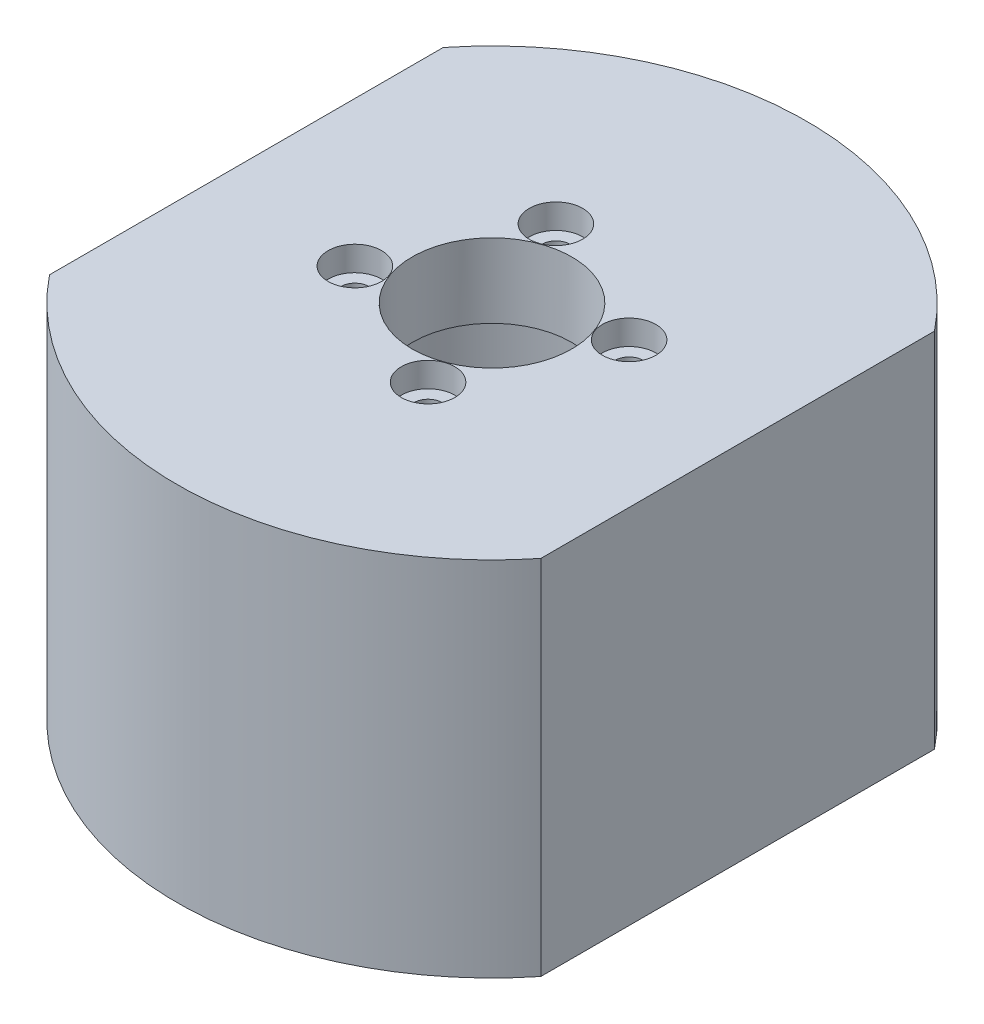
ISO-10303-21;
HEADER;
FILE_DESCRIPTION(('STEP AP214'),'2;1');
FILE_NAME('part.step','',(''),(''),'','','');
FILE_SCHEMA(('AUTOMOTIVE_DESIGN { 1 0 10303 214 1 1 1 1 }'));
ENDSEC;
DATA;
#1=APPLICATION_CONTEXT('core data for automotive mechanical design processes');
#2=APPLICATION_PROTOCOL_DEFINITION('international standard','automotive_design',2000,#1);
#3=PRODUCT_CONTEXT('',#1,'mechanical');
#4=PRODUCT('Part','Part','',(#3));
#5=PRODUCT_RELATED_PRODUCT_CATEGORY('part','',(#4));
#6=PRODUCT_DEFINITION_FORMATION('','',#4);
#7=PRODUCT_DEFINITION_CONTEXT('part definition',#1,'design');
#8=PRODUCT_DEFINITION('design','',#6,#7);
#9=PRODUCT_DEFINITION_SHAPE('','',#8);
#10=(LENGTH_UNIT() NAMED_UNIT(*) SI_UNIT(.MILLI.,.METRE.));
#11=(NAMED_UNIT(*) PLANE_ANGLE_UNIT() SI_UNIT($,.RADIAN.));
#12=(NAMED_UNIT(*) SI_UNIT($,.STERADIAN.) SOLID_ANGLE_UNIT());
#13=UNCERTAINTY_MEASURE_WITH_UNIT(LENGTH_MEASURE(1.E-05),#10,'distance_accuracy_value','');
#14=(GEOMETRIC_REPRESENTATION_CONTEXT(3) GLOBAL_UNCERTAINTY_ASSIGNED_CONTEXT((#13)) GLOBAL_UNIT_ASSIGNED_CONTEXT((#10,
#11,#12)) REPRESENTATION_CONTEXT('',''));
#15=CARTESIAN_POINT('',(0.,0.,0.));
#16=DIRECTION('',(0.,0.,1.));
#17=DIRECTION('',(1.,0.,0.));
#18=AXIS2_PLACEMENT_3D('',#15,#16,#17);
#19=CARTESIAN_POINT('',(-4.4462618632337,44.,-12.2160040702168));
#20=DIRECTION('',(0.,1.,0.));
#21=DIRECTION('',(0.,0.,1.));
#22=AXIS2_PLACEMENT_3D('',#19,#20,#21);
#23=CYLINDRICAL_SURFACE('',#22,1.69999999999999);
#24=CARTESIAN_POINT('',(-4.4462618632337,41.,-12.2160040702168));
#25=DIRECTION('',(0.,1.,0.));
#26=DIRECTION('',(0.,0.,1.));
#27=AXIS2_PLACEMENT_3D('',#24,#25,#26);
#28=CIRCLE('',#27,1.7);
#29=CARTESIAN_POINT('',(-4.4462618632337,41.,-10.5160040702168));
#30=VERTEX_POINT('',#29);
#31=EDGE_CURVE('E108',#30,#30,#28,.T.);
#32=ORIENTED_EDGE('',*,*,#31,.T.);
#33=EDGE_LOOP('',(#32));
#34=FACE_BOUND('',#33,.T.);
#35=CARTESIAN_POINT('',(-4.4462618632337,35.,-12.2160040702168));
#36=DIRECTION('',(0.,-1.,0.));
#37=DIRECTION('',(0.,0.,-1.));
#38=AXIS2_PLACEMENT_3D('',#35,#36,#37);
#39=CIRCLE('',#38,1.69999999999999);
#40=CARTESIAN_POINT('',(-4.4462618632337,35.,-13.9160040702168));
#41=VERTEX_POINT('',#40);
#42=EDGE_CURVE('E134',#41,#41,#39,.F.);
#43=ORIENTED_EDGE('',*,*,#42,.F.);
#44=EDGE_LOOP('',(#43));
#45=FACE_BOUND('',#44,.T.);
#46=ADVANCED_FACE('F38',(#34,#45),#23,.F.);
#47=CARTESIAN_POINT('',(12.2160040702168,44.,-4.44626186323366));
#48=DIRECTION('',(0.,1.,0.));
#49=DIRECTION('',(0.,0.,1.));
#50=AXIS2_PLACEMENT_3D('',#47,#48,#49);
#51=CYLINDRICAL_SURFACE('',#50,1.69999999999999);
#52=CARTESIAN_POINT('',(12.2160040702168,41.,-4.44626186323366));
#53=DIRECTION('',(0.,1.,0.));
#54=DIRECTION('',(0.,0.,1.));
#55=AXIS2_PLACEMENT_3D('',#52,#53,#54);
#56=CIRCLE('',#55,1.7);
#57=CARTESIAN_POINT('',(12.2160040702168,41.,-2.74626186323366));
#58=VERTEX_POINT('',#57);
#59=EDGE_CURVE('E161',#58,#58,#56,.T.);
#60=ORIENTED_EDGE('',*,*,#59,.T.);
#61=EDGE_LOOP('',(#60));
#62=FACE_BOUND('',#61,.T.);
#63=CARTESIAN_POINT('',(12.2160040702168,35.,-4.44626186323366));
#64=DIRECTION('',(0.,-1.,0.));
#65=DIRECTION('',(0.,0.,-1.));
#66=AXIS2_PLACEMENT_3D('',#63,#64,#65);
#67=CIRCLE('',#66,1.69999999999999);
#68=CARTESIAN_POINT('',(12.2160040702168,35.,-6.14626186323365));
#69=VERTEX_POINT('',#68);
#70=EDGE_CURVE('E120',#69,#69,#67,.F.);
#71=ORIENTED_EDGE('',*,*,#70,.F.);
#72=EDGE_LOOP('',(#71));
#73=FACE_BOUND('',#72,.T.);
#74=ADVANCED_FACE('F206',(#62,#73),#51,.F.);
#75=CARTESIAN_POINT('',(4.4462618632337,44.,12.2160040702168));
#76=DIRECTION('',(0.,1.,0.));
#77=DIRECTION('',(0.,0.,1.));
#78=AXIS2_PLACEMENT_3D('',#75,#76,#77);
#79=CYLINDRICAL_SURFACE('',#78,1.69999999999999);
#80=CARTESIAN_POINT('',(4.4462618632337,41.,12.2160040702168));
#81=DIRECTION('',(0.,1.,0.));
#82=DIRECTION('',(0.,0.,1.));
#83=AXIS2_PLACEMENT_3D('',#80,#81,#82);
#84=CIRCLE('',#83,1.7);
#85=CARTESIAN_POINT('',(4.4462618632337,41.,13.9160040702168));
#86=VERTEX_POINT('',#85);
#87=EDGE_CURVE('E152',#86,#86,#84,.T.);
#88=ORIENTED_EDGE('',*,*,#87,.T.);
#89=EDGE_LOOP('',(#88));
#90=FACE_BOUND('',#89,.T.);
#91=CARTESIAN_POINT('',(4.4462618632337,35.,12.2160040702168));
#92=DIRECTION('',(0.,-1.,0.));
#93=DIRECTION('',(0.,0.,-1.));
#94=AXIS2_PLACEMENT_3D('',#91,#92,#93);
#95=CIRCLE('',#94,1.69999999999999);
#96=CARTESIAN_POINT('',(4.4462618632337,35.,10.5160040702168));
#97=VERTEX_POINT('',#96);
#98=EDGE_CURVE('E115',#97,#97,#95,.F.);
#99=ORIENTED_EDGE('',*,*,#98,.F.);
#100=EDGE_LOOP('',(#99));
#101=FACE_BOUND('',#100,.T.);
#102=ADVANCED_FACE('F211',(#90,#101),#79,.F.);
#103=CARTESIAN_POINT('',(-12.2160040702169,44.,4.44626186323358));
#104=DIRECTION('',(0.,1.,0.));
#105=DIRECTION('',(0.,0.,1.));
#106=AXIS2_PLACEMENT_3D('',#103,#104,#105);
#107=CYLINDRICAL_SURFACE('',#106,1.69999999999999);
#108=CARTESIAN_POINT('',(-12.2160040702169,41.,4.44626186323358));
#109=DIRECTION('',(0.,1.,0.));
#110=DIRECTION('',(0.,0.,1.));
#111=AXIS2_PLACEMENT_3D('',#108,#109,#110);
#112=CIRCLE('',#111,1.7);
#113=CARTESIAN_POINT('',(-12.2160040702169,41.,6.14626186323357));
#114=VERTEX_POINT('',#113);
#115=EDGE_CURVE('E143',#114,#114,#112,.T.);
#116=ORIENTED_EDGE('',*,*,#115,.T.);
#117=EDGE_LOOP('',(#116));
#118=FACE_BOUND('',#117,.T.);
#119=CARTESIAN_POINT('',(-12.2160040702169,35.,4.44626186323358));
#120=DIRECTION('',(0.,-1.,0.));
#121=DIRECTION('',(0.,0.,-1.));
#122=AXIS2_PLACEMENT_3D('',#119,#120,#121);
#123=CIRCLE('',#122,1.69999999999999);
#124=CARTESIAN_POINT('',(-12.2160040702169,35.,2.74626186323358));
#125=VERTEX_POINT('',#124);
#126=EDGE_CURVE('E113',#125,#125,#123,.F.);
#127=ORIENTED_EDGE('',*,*,#126,.F.);
#128=EDGE_LOOP('',(#127));
#129=FACE_BOUND('',#128,.T.);
#130=ADVANCED_FACE('F225',(#118,#129),#107,.F.);
#131=CARTESIAN_POINT('',(0.,44.,0.));
#132=DIRECTION('',(0.,-1.,0.));
#133=DIRECTION('',(0.,0.,-1.));
#134=AXIS2_PLACEMENT_3D('',#131,#132,#133);
#135=CYLINDRICAL_SURFACE('',#134,38.25);
#136=CARTESIAN_POINT('',(0.,0.,0.));
#137=DIRECTION('',(0.,1.,0.));
#138=DIRECTION('',(0.,0.,1.));
#139=AXIS2_PLACEMENT_3D('',#136,#137,#138);
#140=CIRCLE('',#139,38.25);
#141=CARTESIAN_POINT('',(29.85,0.,-23.9173577135937));
#142=VERTEX_POINT('',#141);
#143=CARTESIAN_POINT('',(-29.85,0.,-23.9173577135937));
#144=VERTEX_POINT('',#143);
#145=EDGE_CURVE('E105',#142,#144,#140,.T.);
#146=ORIENTED_EDGE('',*,*,#145,.T.);
#147=DIRECTION('',(0.,-1.,0.));
#148=VECTOR('',#147,1.);
#149=CARTESIAN_POINT('',(-29.85,44.,-23.9173577135937));
#150=LINE('',#149,#148);
#151=CARTESIAN_POINT('',(-29.85,44.,-23.9173577135937));
#152=VERTEX_POINT('',#151);
#153=EDGE_CURVE('E11',#152,#144,#150,.T.);
#154=ORIENTED_EDGE('',*,*,#153,.F.);
#155=CARTESIAN_POINT('',(0.,44.,0.));
#156=DIRECTION('',(0.,1.,0.));
#157=DIRECTION('',(0.,0.,1.));
#158=AXIS2_PLACEMENT_3D('',#155,#156,#157);
#159=CIRCLE('',#158,38.25);
#160=CARTESIAN_POINT('',(29.85,44.,-23.9173577135937));
#161=VERTEX_POINT('',#160);
#162=EDGE_CURVE('E92',#161,#152,#159,.T.);
#163=ORIENTED_EDGE('',*,*,#162,.F.);
#164=DIRECTION('',(0.,-1.,0.));
#165=VECTOR('',#164,1.);
#166=CARTESIAN_POINT('',(29.85,44.,-23.9173577135937));
#167=LINE('',#166,#165);
#168=EDGE_CURVE('E101',#161,#142,#167,.T.);
#169=ORIENTED_EDGE('',*,*,#168,.T.);
#170=EDGE_LOOP('',(#146,#154,#163,#169));
#171=FACE_BOUND('',#170,.T.);
#172=ADVANCED_FACE('F40',(#171),#135,.T.);
#173=CARTESIAN_POINT('',(-29.85,44.,-23.9173577135937));
#174=DIRECTION('',(1.,0.,0.));
#175=DIRECTION('',(0.,0.,-1.));
#176=AXIS2_PLACEMENT_3D('',#173,#174,#175);
#177=PLANE('',#176);
#178=DIRECTION('',(0.,0.,1.));
#179=VECTOR('',#178,1.);
#180=CARTESIAN_POINT('',(-29.85,0.,-23.9173577135937));
#181=LINE('',#180,#179);
#182=CARTESIAN_POINT('',(-29.85,0.,23.9173577135937));
#183=VERTEX_POINT('',#182);
#184=EDGE_CURVE('E96',#144,#183,#181,.T.);
#185=ORIENTED_EDGE('',*,*,#184,.T.);
#186=DIRECTION('',(0.,-1.,0.));
#187=VECTOR('',#186,1.);
#188=CARTESIAN_POINT('',(-29.85,44.,23.9173577135937));
#189=LINE('',#188,#187);
#190=CARTESIAN_POINT('',(-29.85,44.,23.9173577135937));
#191=VERTEX_POINT('',#190);
#192=EDGE_CURVE('E48',#191,#183,#189,.T.);
#193=ORIENTED_EDGE('',*,*,#192,.F.);
#194=DIRECTION('',(0.,0.,1.));
#195=VECTOR('',#194,1.);
#196=CARTESIAN_POINT('',(-29.85,44.,-23.9173577135937));
#197=LINE('',#196,#195);
#198=EDGE_CURVE('E87',#152,#191,#197,.T.);
#199=ORIENTED_EDGE('',*,*,#198,.F.);
#200=ORIENTED_EDGE('',*,*,#153,.T.);
#201=EDGE_LOOP('',(#185,#193,#199,#200));
#202=FACE_BOUND('',#201,.T.);
#203=ADVANCED_FACE('F95',(#202),#177,.F.);
#204=CARTESIAN_POINT('',(0.,44.,0.));
#205=DIRECTION('',(0.,-1.,0.));
#206=DIRECTION('',(0.,0.,-1.));
#207=AXIS2_PLACEMENT_3D('',#204,#205,#206);
#208=CYLINDRICAL_SURFACE('',#207,38.25);
#209=CARTESIAN_POINT('',(0.,0.,0.));
#210=DIRECTION('',(0.,1.,0.));
#211=DIRECTION('',(0.,0.,1.));
#212=AXIS2_PLACEMENT_3D('',#209,#210,#211);
#213=CIRCLE('',#212,38.25);
#214=CARTESIAN_POINT('',(29.85,0.,23.9173577135937));
#215=VERTEX_POINT('',#214);
#216=EDGE_CURVE('E74',#183,#215,#213,.T.);
#217=ORIENTED_EDGE('',*,*,#216,.T.);
#218=DIRECTION('',(0.,-1.,0.));
#219=VECTOR('',#218,1.);
#220=CARTESIAN_POINT('',(29.85,44.,23.9173577135937));
#221=LINE('',#220,#219);
#222=CARTESIAN_POINT('',(29.85,44.,23.9173577135937));
#223=VERTEX_POINT('',#222);
#224=EDGE_CURVE('E97',#223,#215,#221,.T.);
#225=ORIENTED_EDGE('',*,*,#224,.F.);
#226=CARTESIAN_POINT('',(0.,44.,0.));
#227=DIRECTION('',(0.,1.,0.));
#228=DIRECTION('',(0.,0.,1.));
#229=AXIS2_PLACEMENT_3D('',#226,#227,#228);
#230=CIRCLE('',#229,38.25);
#231=EDGE_CURVE('E90',#191,#223,#230,.T.);
#232=ORIENTED_EDGE('',*,*,#231,.F.);
#233=ORIENTED_EDGE('',*,*,#192,.T.);
#234=EDGE_LOOP('',(#217,#225,#232,#233));
#235=FACE_BOUND('',#234,.T.);
#236=ADVANCED_FACE('F99',(#235),#208,.T.);
#237=CARTESIAN_POINT('',(29.85,44.,-23.9173577135937));
#238=DIRECTION('',(-1.,0.,0.));
#239=DIRECTION('',(0.,0.,1.));
#240=AXIS2_PLACEMENT_3D('',#237,#238,#239);
#241=PLANE('',#240);
#242=DIRECTION('',(0.,0.,-1.));
#243=VECTOR('',#242,1.);
#244=CARTESIAN_POINT('',(29.85,0.,-23.9173577135937));
#245=LINE('',#244,#243);
#246=EDGE_CURVE('E80',#215,#142,#245,.T.);
#247=ORIENTED_EDGE('',*,*,#246,.T.);
#248=ORIENTED_EDGE('',*,*,#168,.F.);
#249=DIRECTION('',(0.,0.,-1.));
#250=VECTOR('',#249,1.);
#251=CARTESIAN_POINT('',(29.85,44.,-23.9173577135937));
#252=LINE('',#251,#250);
#253=EDGE_CURVE('E57',#223,#161,#252,.T.);
#254=ORIENTED_EDGE('',*,*,#253,.F.);
#255=ORIENTED_EDGE('',*,*,#224,.T.);
#256=EDGE_LOOP('',(#247,#248,#254,#255));
#257=FACE_BOUND('',#256,.T.);
#258=ADVANCED_FACE('F190',(#257),#241,.F.);
#259=CARTESIAN_POINT('',(0.,44.,0.));
#260=DIRECTION('',(0.,1.,0.));
#261=DIRECTION('',(0.,0.,1.));
#262=AXIS2_PLACEMENT_3D('',#259,#260,#261);
#263=PLANE('',#262);
#264=CARTESIAN_POINT('',(0.,44.,0.));
#265=DIRECTION('',(0.,1.,0.));
#266=DIRECTION('',(0.,0.,1.));
#267=AXIS2_PLACEMENT_3D('',#264,#265,#266);
#268=CIRCLE('',#267,9.7);
#269=CARTESIAN_POINT('',(0.,44.,9.7));
#270=VERTEX_POINT('',#269);
#271=EDGE_CURVE('E130',#270,#270,#268,.T.);
#272=ORIENTED_EDGE('',*,*,#271,.F.);
#273=EDGE_LOOP('',(#272));
#274=FACE_BOUND('',#273,.T.);
#275=CARTESIAN_POINT('',(-12.2160040702169,44.,4.44626186323358));
#276=DIRECTION('',(0.,1.,0.));
#277=DIRECTION('',(0.,0.,1.));
#278=AXIS2_PLACEMENT_3D('',#275,#276,#277);
#279=CIRCLE('',#278,3.25);
#280=CARTESIAN_POINT('',(-12.2160040702169,44.,7.69626186323357));
#281=VERTEX_POINT('',#280);
#282=EDGE_CURVE('E137',#281,#281,#279,.T.);
#283=ORIENTED_EDGE('',*,*,#282,.F.);
#284=EDGE_LOOP('',(#283));
#285=FACE_BOUND('',#284,.T.);
#286=CARTESIAN_POINT('',(4.4462618632337,44.,12.2160040702168));
#287=DIRECTION('',(0.,1.,0.));
#288=DIRECTION('',(0.,0.,1.));
#289=AXIS2_PLACEMENT_3D('',#286,#287,#288);
#290=CIRCLE('',#289,3.25);
#291=CARTESIAN_POINT('',(4.4462618632337,44.,15.4660040702168));
#292=VERTEX_POINT('',#291);
#293=EDGE_CURVE('E146',#292,#292,#290,.T.);
#294=ORIENTED_EDGE('',*,*,#293,.F.);
#295=EDGE_LOOP('',(#294));
#296=FACE_BOUND('',#295,.T.);
#297=CARTESIAN_POINT('',(12.2160040702168,44.,-4.44626186323366));
#298=DIRECTION('',(0.,1.,0.));
#299=DIRECTION('',(0.,0.,1.));
#300=AXIS2_PLACEMENT_3D('',#297,#298,#299);
#301=CIRCLE('',#300,3.25);
#302=CARTESIAN_POINT('',(12.2160040702168,44.,-1.19626186323366));
#303=VERTEX_POINT('',#302);
#304=EDGE_CURVE('E155',#303,#303,#301,.T.);
#305=ORIENTED_EDGE('',*,*,#304,.F.);
#306=EDGE_LOOP('',(#305));
#307=FACE_BOUND('',#306,.T.);
#308=CARTESIAN_POINT('',(-4.4462618632337,44.,-12.2160040702168));
#309=DIRECTION('',(0.,1.,0.));
#310=DIRECTION('',(0.,0.,1.));
#311=AXIS2_PLACEMENT_3D('',#308,#309,#310);
#312=CIRCLE('',#311,3.25);
#313=CARTESIAN_POINT('',(-4.4462618632337,44.,-8.96600407021681));
#314=VERTEX_POINT('',#313);
#315=EDGE_CURVE('E164',#314,#314,#312,.T.);
#316=ORIENTED_EDGE('',*,*,#315,.F.);
#317=EDGE_LOOP('',(#316));
#318=FACE_BOUND('',#317,.T.);
#319=ORIENTED_EDGE('',*,*,#162,.T.);
#320=ORIENTED_EDGE('',*,*,#198,.T.);
#321=ORIENTED_EDGE('',*,*,#231,.T.);
#322=ORIENTED_EDGE('',*,*,#253,.T.);
#323=EDGE_LOOP('',(#319,#320,#321,#322));
#324=FACE_BOUND('',#323,.T.);
#325=ADVANCED_FACE('F88',(#274,#285,#296,#307,#318,#324),#263,.T.);
#326=CARTESIAN_POINT('',(0.,0.,0.));
#327=DIRECTION('',(0.,1.,0.));
#328=DIRECTION('',(0.,0.,1.));
#329=AXIS2_PLACEMENT_3D('',#326,#327,#328);
#330=PLANE('',#329);
#331=CARTESIAN_POINT('',(0.,0.,0.));
#332=DIRECTION('',(0.,-1.,0.));
#333=DIRECTION('',(0.,0.,-1.));
#334=AXIS2_PLACEMENT_3D('',#331,#332,#333);
#335=CIRCLE('',#334,16.2);
#336=CARTESIAN_POINT('',(0.,0.,-16.2));
#337=VERTEX_POINT('',#336);
#338=EDGE_CURVE('E123',#337,#337,#335,.T.);
#339=ORIENTED_EDGE('',*,*,#338,.F.);
#340=EDGE_LOOP('',(#339));
#341=FACE_BOUND('',#340,.T.);
#342=ORIENTED_EDGE('',*,*,#145,.F.);
#343=ORIENTED_EDGE('',*,*,#246,.F.);
#344=ORIENTED_EDGE('',*,*,#216,.F.);
#345=ORIENTED_EDGE('',*,*,#184,.F.);
#346=EDGE_LOOP('',(#342,#343,#344,#345));
#347=FACE_BOUND('',#346,.T.);
#348=ADVANCED_FACE('F179',(#341,#347),#330,.F.);
#349=CARTESIAN_POINT('',(-2.7462618632337,41.,-12.2160040702168));
#350=DIRECTION('',(0.,-1.,0.));
#351=DIRECTION('',(0.,0.,-1.));
#352=AXIS2_PLACEMENT_3D('',#349,#350,#351);
#353=PLANE('',#352);
#354=ORIENTED_EDGE('',*,*,#31,.F.);
#355=EDGE_LOOP('',(#354));
#356=FACE_BOUND('',#355,.T.);
#357=CARTESIAN_POINT('',(-4.4462618632337,41.,-12.2160040702168));
#358=DIRECTION('',(0.,1.,0.));
#359=DIRECTION('',(0.,0.,1.));
#360=AXIS2_PLACEMENT_3D('',#357,#358,#359);
#361=CIRCLE('',#360,3.25);
#362=CARTESIAN_POINT('',(-4.4462618632337,41.,-8.96600407021681));
#363=VERTEX_POINT('',#362);
#364=EDGE_CURVE('E167',#363,#363,#361,.T.);
#365=ORIENTED_EDGE('',*,*,#364,.T.);
#366=EDGE_LOOP('',(#365));
#367=FACE_BOUND('',#366,.T.);
#368=ADVANCED_FACE('F175',(#356,#367),#353,.F.);
#369=CARTESIAN_POINT('',(-4.4462618632337,44.,-12.2160040702168));
#370=DIRECTION('',(0.,1.,0.));
#371=DIRECTION('',(0.,0.,1.));
#372=AXIS2_PLACEMENT_3D('',#369,#370,#371);
#373=CYLINDRICAL_SURFACE('',#372,3.25);
#374=ORIENTED_EDGE('',*,*,#364,.F.);
#375=EDGE_LOOP('',(#374));
#376=FACE_BOUND('',#375,.T.);
#377=ORIENTED_EDGE('',*,*,#315,.T.);
#378=EDGE_LOOP('',(#377));
#379=FACE_BOUND('',#378,.T.);
#380=ADVANCED_FACE('F178',(#376,#379),#373,.F.);
#381=CARTESIAN_POINT('',(13.9160040702168,41.,-4.44626186323366));
#382=DIRECTION('',(0.,-1.,0.));
#383=DIRECTION('',(0.,0.,-1.));
#384=AXIS2_PLACEMENT_3D('',#381,#382,#383);
#385=PLANE('',#384);
#386=ORIENTED_EDGE('',*,*,#59,.F.);
#387=EDGE_LOOP('',(#386));
#388=FACE_BOUND('',#387,.T.);
#389=CARTESIAN_POINT('',(12.2160040702168,41.,-4.44626186323366));
#390=DIRECTION('',(0.,1.,0.));
#391=DIRECTION('',(0.,0.,1.));
#392=AXIS2_PLACEMENT_3D('',#389,#390,#391);
#393=CIRCLE('',#392,3.25);
#394=CARTESIAN_POINT('',(12.2160040702168,41.,-1.19626186323366));
#395=VERTEX_POINT('',#394);
#396=EDGE_CURVE('E158',#395,#395,#393,.T.);
#397=ORIENTED_EDGE('',*,*,#396,.T.);
#398=EDGE_LOOP('',(#397));
#399=FACE_BOUND('',#398,.T.);
#400=ADVANCED_FACE('F185',(#388,#399),#385,.F.);
#401=CARTESIAN_POINT('',(12.2160040702168,44.,-4.44626186323366));
#402=DIRECTION('',(0.,1.,0.));
#403=DIRECTION('',(0.,0.,1.));
#404=AXIS2_PLACEMENT_3D('',#401,#402,#403);
#405=CYLINDRICAL_SURFACE('',#404,3.25);
#406=ORIENTED_EDGE('',*,*,#396,.F.);
#407=EDGE_LOOP('',(#406));
#408=FACE_BOUND('',#407,.T.);
#409=ORIENTED_EDGE('',*,*,#304,.T.);
#410=EDGE_LOOP('',(#409));
#411=FACE_BOUND('',#410,.T.);
#412=ADVANCED_FACE('F217',(#408,#411),#405,.F.);
#413=CARTESIAN_POINT('',(6.1462618632337,41.,12.2160040702168));
#414=DIRECTION('',(0.,-1.,0.));
#415=DIRECTION('',(0.,0.,-1.));
#416=AXIS2_PLACEMENT_3D('',#413,#414,#415);
#417=PLANE('',#416);
#418=ORIENTED_EDGE('',*,*,#87,.F.);
#419=EDGE_LOOP('',(#418));
#420=FACE_BOUND('',#419,.T.);
#421=CARTESIAN_POINT('',(4.4462618632337,41.,12.2160040702168));
#422=DIRECTION('',(0.,1.,0.));
#423=DIRECTION('',(0.,0.,1.));
#424=AXIS2_PLACEMENT_3D('',#421,#422,#423);
#425=CIRCLE('',#424,3.25);
#426=CARTESIAN_POINT('',(4.4462618632337,41.,15.4660040702168));
#427=VERTEX_POINT('',#426);
#428=EDGE_CURVE('E149',#427,#427,#425,.T.);
#429=ORIENTED_EDGE('',*,*,#428,.T.);
#430=EDGE_LOOP('',(#429));
#431=FACE_BOUND('',#430,.T.);
#432=ADVANCED_FACE('F221',(#420,#431),#417,.F.);
#433=CARTESIAN_POINT('',(4.4462618632337,44.,12.2160040702168));
#434=DIRECTION('',(0.,1.,0.));
#435=DIRECTION('',(0.,0.,1.));
#436=AXIS2_PLACEMENT_3D('',#433,#434,#435);
#437=CYLINDRICAL_SURFACE('',#436,3.25);
#438=ORIENTED_EDGE('',*,*,#428,.F.);
#439=EDGE_LOOP('',(#438));
#440=FACE_BOUND('',#439,.T.);
#441=ORIENTED_EDGE('',*,*,#293,.T.);
#442=EDGE_LOOP('',(#441));
#443=FACE_BOUND('',#442,.T.);
#444=ADVANCED_FACE('F229',(#440,#443),#437,.F.);
#445=CARTESIAN_POINT('',(-10.5160040702169,41.,4.44626186323358));
#446=DIRECTION('',(0.,-1.,0.));
#447=DIRECTION('',(0.,0.,-1.));
#448=AXIS2_PLACEMENT_3D('',#445,#446,#447);
#449=PLANE('',#448);
#450=ORIENTED_EDGE('',*,*,#115,.F.);
#451=EDGE_LOOP('',(#450));
#452=FACE_BOUND('',#451,.T.);
#453=CARTESIAN_POINT('',(-12.2160040702169,41.,4.44626186323358));
#454=DIRECTION('',(0.,1.,0.));
#455=DIRECTION('',(0.,0.,1.));
#456=AXIS2_PLACEMENT_3D('',#453,#454,#455);
#457=CIRCLE('',#456,3.25);
#458=CARTESIAN_POINT('',(-12.2160040702169,41.,7.69626186323357));
#459=VERTEX_POINT('',#458);
#460=EDGE_CURVE('E140',#459,#459,#457,.T.);
#461=ORIENTED_EDGE('',*,*,#460,.T.);
#462=EDGE_LOOP('',(#461));
#463=FACE_BOUND('',#462,.T.);
#464=ADVANCED_FACE('F233',(#452,#463),#449,.F.);
#465=CARTESIAN_POINT('',(-12.2160040702169,44.,4.44626186323358));
#466=DIRECTION('',(0.,1.,0.));
#467=DIRECTION('',(0.,0.,1.));
#468=AXIS2_PLACEMENT_3D('',#465,#466,#467);
#469=CYLINDRICAL_SURFACE('',#468,3.25);
#470=ORIENTED_EDGE('',*,*,#460,.F.);
#471=EDGE_LOOP('',(#470));
#472=FACE_BOUND('',#471,.T.);
#473=ORIENTED_EDGE('',*,*,#282,.T.);
#474=EDGE_LOOP('',(#473));
#475=FACE_BOUND('',#474,.T.);
#476=ADVANCED_FACE('F240',(#472,#475),#469,.F.);
#477=CARTESIAN_POINT('',(0.,35.,0.));
#478=DIRECTION('',(0.,-1.,0.));
#479=DIRECTION('',(0.,0.,-1.));
#480=AXIS2_PLACEMENT_3D('',#477,#478,#479);
#481=PLANE('',#480);
#482=CARTESIAN_POINT('',(0.,35.,0.));
#483=DIRECTION('',(0.,-1.,0.));
#484=DIRECTION('',(0.,0.,-1.));
#485=AXIS2_PLACEMENT_3D('',#482,#483,#484);
#486=CIRCLE('',#485,9.7);
#487=CARTESIAN_POINT('',(0.,35.,-9.7));
#488=VERTEX_POINT('',#487);
#489=EDGE_CURVE('E42',#488,#488,#486,.T.);
#490=ORIENTED_EDGE('',*,*,#489,.F.);
#491=EDGE_LOOP('',(#490));
#492=FACE_BOUND('',#491,.T.);
#493=CARTESIAN_POINT('',(0.,35.,0.));
#494=DIRECTION('',(0.,-1.,0.));
#495=DIRECTION('',(0.,0.,-1.));
#496=AXIS2_PLACEMENT_3D('',#493,#494,#495);
#497=CIRCLE('',#496,16.2);
#498=CARTESIAN_POINT('',(0.,35.,-16.2));
#499=VERTEX_POINT('',#498);
#500=EDGE_CURVE('E116',#499,#499,#497,.T.);
#501=ORIENTED_EDGE('',*,*,#500,.T.);
#502=EDGE_LOOP('',(#501));
#503=FACE_BOUND('',#502,.T.);
#504=ORIENTED_EDGE('',*,*,#126,.T.);
#505=EDGE_LOOP('',(#504));
#506=FACE_BOUND('',#505,.T.);
#507=ORIENTED_EDGE('',*,*,#98,.T.);
#508=EDGE_LOOP('',(#507));
#509=FACE_BOUND('',#508,.T.);
#510=ORIENTED_EDGE('',*,*,#70,.T.);
#511=EDGE_LOOP('',(#510));
#512=FACE_BOUND('',#511,.T.);
#513=ORIENTED_EDGE('',*,*,#42,.T.);
#514=EDGE_LOOP('',(#513));
#515=FACE_BOUND('',#514,.T.);
#516=ADVANCED_FACE('F243',(#492,#503,#506,#509,#512,#515),#481,.T.);
#517=CARTESIAN_POINT('',(0.,35.,0.));
#518=DIRECTION('',(0.,-1.,0.));
#519=DIRECTION('',(0.,0.,-1.));
#520=AXIS2_PLACEMENT_3D('',#517,#518,#519);
#521=CYLINDRICAL_SURFACE('',#520,16.2);
#522=ORIENTED_EDGE('',*,*,#500,.F.);
#523=EDGE_LOOP('',(#522));
#524=FACE_BOUND('',#523,.T.);
#525=ORIENTED_EDGE('',*,*,#338,.T.);
#526=EDGE_LOOP('',(#525));
#527=FACE_BOUND('',#526,.T.);
#528=ADVANCED_FACE('F245',(#524,#527),#521,.F.);
#529=CARTESIAN_POINT('',(0.,0.,0.));
#530=DIRECTION('',(0.,1.,0.));
#531=DIRECTION('',(0.,0.,1.));
#532=AXIS2_PLACEMENT_3D('',#529,#530,#531);
#533=CYLINDRICAL_SURFACE('',#532,9.7);
#534=ORIENTED_EDGE('',*,*,#489,.T.);
#535=EDGE_LOOP('',(#534));
#536=FACE_BOUND('',#535,.T.);
#537=ORIENTED_EDGE('',*,*,#271,.T.);
#538=EDGE_LOOP('',(#537));
#539=FACE_BOUND('',#538,.T.);
#540=ADVANCED_FACE('F247',(#536,#539),#533,.F.);
#541=CLOSED_SHELL('',(#46,#74,#102,#130,#172,#203,#236,#258,#325,#348,#368,#380,#400,#412,#432,
#444,#464,#476,#516,#528,#540));
#542=MANIFOLD_SOLID_BREP('B2',#541);
#543=ADVANCED_BREP_SHAPE_REPRESENTATION('',(#18,#542),#14);
#544=SHAPE_DEFINITION_REPRESENTATION(#9,#543);
ENDSEC;
END-ISO-10303-21;
